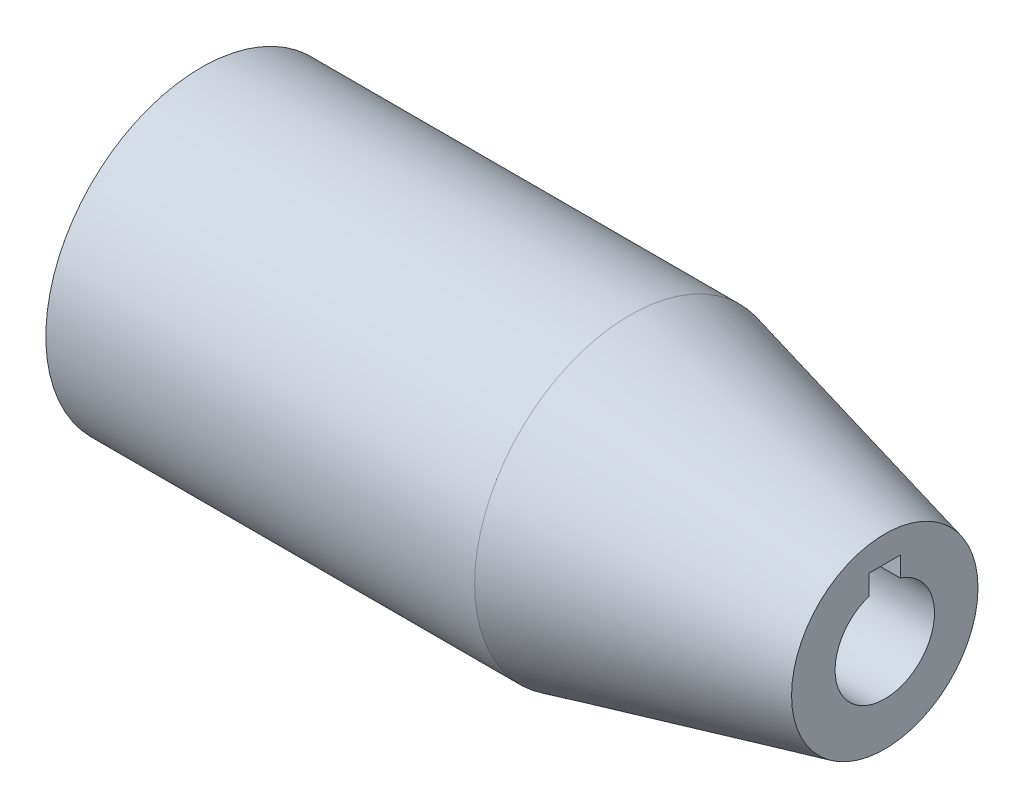
ISO-10303-21;
HEADER;
FILE_DESCRIPTION(('STEP AP214'),'2;1');
FILE_NAME('part.step','',(''),(''),'','','');
FILE_SCHEMA(('AUTOMOTIVE_DESIGN { 1 0 10303 214 1 1 1 1 }'));
ENDSEC;
DATA;
#1=APPLICATION_CONTEXT('core data for automotive mechanical design processes');
#2=APPLICATION_PROTOCOL_DEFINITION('international standard','automotive_design',2000,#1);
#3=PRODUCT_CONTEXT('',#1,'mechanical');
#4=PRODUCT('Part','Part','',(#3));
#5=PRODUCT_RELATED_PRODUCT_CATEGORY('part','',(#4));
#6=PRODUCT_DEFINITION_FORMATION('','',#4);
#7=PRODUCT_DEFINITION_CONTEXT('part definition',#1,'design');
#8=PRODUCT_DEFINITION('design','',#6,#7);
#9=PRODUCT_DEFINITION_SHAPE('','',#8);
#10=(LENGTH_UNIT() NAMED_UNIT(*) SI_UNIT(.MILLI.,.METRE.));
#11=(NAMED_UNIT(*) PLANE_ANGLE_UNIT() SI_UNIT($,.RADIAN.));
#12=(NAMED_UNIT(*) SI_UNIT($,.STERADIAN.) SOLID_ANGLE_UNIT());
#13=UNCERTAINTY_MEASURE_WITH_UNIT(LENGTH_MEASURE(1.E-05),#10,'distance_accuracy_value','');
#14=(GEOMETRIC_REPRESENTATION_CONTEXT(3) GLOBAL_UNCERTAINTY_ASSIGNED_CONTEXT((#13)) GLOBAL_UNIT_ASSIGNED_CONTEXT((#10,
#11,#12)) REPRESENTATION_CONTEXT('',''));
#15=CARTESIAN_POINT('',(0.,0.,0.));
#16=DIRECTION('',(0.,0.,1.));
#17=DIRECTION('',(1.,0.,0.));
#18=AXIS2_PLACEMENT_3D('',#15,#16,#17);
#19=CARTESIAN_POINT('',(-9.,0.,0.));
#20=DIRECTION('',(1.,0.,0.));
#21=DIRECTION('',(0.,0.,-1.));
#22=AXIS2_PLACEMENT_3D('',#19,#20,#21);
#23=CYLINDRICAL_SURFACE('',#22,25.);
#24=CARTESIAN_POINT('',(0.,0.,0.));
#25=DIRECTION('',(1.,0.,0.));
#26=DIRECTION('',(0.,0.,-1.));
#27=AXIS2_PLACEMENT_3D('',#24,#25,#26);
#28=CIRCLE('',#27,25.);
#29=CARTESIAN_POINT('',(0.,0.,-25.));
#30=VERTEX_POINT('',#29);
#31=EDGE_CURVE('E141',#30,#30,#28,.T.);
#32=ORIENTED_EDGE('',*,*,#31,.F.);
#33=EDGE_LOOP('',(#32));
#34=FACE_BOUND('',#33,.T.);
#35=CARTESIAN_POINT('',(-69.,0.,0.));
#36=DIRECTION('',(1.,0.,0.));
#37=DIRECTION('',(0.,0.,-1.));
#38=AXIS2_PLACEMENT_3D('',#35,#36,#37);
#39=CIRCLE('',#38,25.);
#40=CARTESIAN_POINT('',(-69.,0.,-25.));
#41=VERTEX_POINT('',#40);
#42=EDGE_CURVE('E121',#41,#41,#39,.T.);
#43=ORIENTED_EDGE('',*,*,#42,.T.);
#44=EDGE_LOOP('',(#43));
#45=FACE_BOUND('',#44,.T.);
#46=ADVANCED_FACE('F36',(#34,#45),#23,.T.);
#47=CARTESIAN_POINT('',(-69.,0.,0.));
#48=DIRECTION('',(1.,0.,0.));
#49=DIRECTION('',(0.,0.,-1.));
#50=AXIS2_PLACEMENT_3D('',#47,#48,#49);
#51=CYLINDRICAL_SURFACE('',#50,14.);
#52=CARTESIAN_POINT('',(-9.,0.,0.));
#53=DIRECTION('',(1.,0.,0.));
#54=DIRECTION('',(0.,0.,-1.));
#55=AXIS2_PLACEMENT_3D('',#52,#53,#54);
#56=CIRCLE('',#55,14.);
#57=CARTESIAN_POINT('',(-9.,13.4164078649987,4.));
#58=VERTEX_POINT('',#57);
#59=CARTESIAN_POINT('',(-9.,13.4164078649987,-4.));
#60=VERTEX_POINT('',#59);
#61=EDGE_CURVE('E136',#58,#60,#56,.T.);
#62=ORIENTED_EDGE('',*,*,#61,.T.);
#63=DIRECTION('',(1.,0.,0.));
#64=VECTOR('',#63,1.);
#65=CARTESIAN_POINT('',(-69.,13.4164078649987,-4.));
#66=LINE('',#65,#64);
#67=CARTESIAN_POINT('',(-69.,13.4164078649987,-4.));
#68=VERTEX_POINT('',#67);
#69=EDGE_CURVE('E124',#68,#60,#66,.T.);
#70=ORIENTED_EDGE('',*,*,#69,.F.);
#71=CARTESIAN_POINT('',(-69.,0.,0.));
#72=DIRECTION('',(1.,0.,0.));
#73=DIRECTION('',(0.,0.,-1.));
#74=AXIS2_PLACEMENT_3D('',#71,#72,#73);
#75=CIRCLE('',#74,14.);
#76=CARTESIAN_POINT('',(-69.,13.4164078649987,4.));
#77=VERTEX_POINT('',#76);
#78=EDGE_CURVE('E105',#77,#68,#75,.T.);
#79=ORIENTED_EDGE('',*,*,#78,.F.);
#80=DIRECTION('',(1.,0.,0.));
#81=VECTOR('',#80,1.);
#82=CARTESIAN_POINT('',(-69.,13.4164078649987,4.));
#83=LINE('',#82,#81);
#84=EDGE_CURVE('E115',#77,#58,#83,.T.);
#85=ORIENTED_EDGE('',*,*,#84,.T.);
#86=EDGE_LOOP('',(#62,#70,#79,#85));
#87=FACE_BOUND('',#86,.T.);
#88=ADVANCED_FACE('F123',(#87),#51,.F.);
#89=CARTESIAN_POINT('',(-69.,0.,-4.));
#90=DIRECTION('',(0.,0.,1.));
#91=DIRECTION('',(1.,0.,0.));
#92=AXIS2_PLACEMENT_3D('',#89,#90,#91);
#93=PLANE('',#92);
#94=DIRECTION('',(0.,-1.,0.));
#95=VECTOR('',#94,1.);
#96=CARTESIAN_POINT('',(-9.,0.,-4.));
#97=LINE('',#96,#95);
#98=CARTESIAN_POINT('',(-9.,17.3,-4.));
#99=VERTEX_POINT('',#98);
#100=EDGE_CURVE('E51',#99,#60,#97,.T.);
#101=ORIENTED_EDGE('',*,*,#100,.F.);
#102=DIRECTION('',(1.,0.,0.));
#103=VECTOR('',#102,1.);
#104=CARTESIAN_POINT('',(-69.,17.3,-4.));
#105=LINE('',#104,#103);
#106=CARTESIAN_POINT('',(-69.,17.3,-4.));
#107=VERTEX_POINT('',#106);
#108=EDGE_CURVE('E142',#107,#99,#105,.T.);
#109=ORIENTED_EDGE('',*,*,#108,.F.);
#110=DIRECTION('',(0.,-1.,0.));
#111=VECTOR('',#110,1.);
#112=CARTESIAN_POINT('',(-69.,0.,-4.));
#113=LINE('',#112,#111);
#114=EDGE_CURVE('E132',#107,#68,#113,.T.);
#115=ORIENTED_EDGE('',*,*,#114,.T.);
#116=ORIENTED_EDGE('',*,*,#69,.T.);
#117=EDGE_LOOP('',(#101,#109,#115,#116));
#118=FACE_BOUND('',#117,.T.);
#119=ADVANCED_FACE('F205',(#118),#93,.T.);
#120=CARTESIAN_POINT('',(-69.,17.3,0.));
#121=DIRECTION('',(0.,1.,0.));
#122=DIRECTION('',(0.,0.,1.));
#123=AXIS2_PLACEMENT_3D('',#120,#121,#122);
#124=PLANE('',#123);
#125=DIRECTION('',(0.,0.,1.));
#126=VECTOR('',#125,1.);
#127=CARTESIAN_POINT('',(-9.,17.3,0.));
#128=LINE('',#127,#126);
#129=CARTESIAN_POINT('',(-9.,17.3,4.));
#130=VERTEX_POINT('',#129);
#131=EDGE_CURVE('E56',#99,#130,#128,.T.);
#132=ORIENTED_EDGE('',*,*,#131,.T.);
#133=DIRECTION('',(1.,0.,0.));
#134=VECTOR('',#133,1.);
#135=CARTESIAN_POINT('',(-69.,17.3,4.));
#136=LINE('',#135,#134);
#137=CARTESIAN_POINT('',(-69.,17.3,4.));
#138=VERTEX_POINT('',#137);
#139=EDGE_CURVE('E120',#138,#130,#136,.T.);
#140=ORIENTED_EDGE('',*,*,#139,.F.);
#141=DIRECTION('',(0.,0.,1.));
#142=VECTOR('',#141,1.);
#143=CARTESIAN_POINT('',(-69.,17.3,0.));
#144=LINE('',#143,#142);
#145=EDGE_CURVE('E108',#107,#138,#144,.T.);
#146=ORIENTED_EDGE('',*,*,#145,.F.);
#147=ORIENTED_EDGE('',*,*,#108,.T.);
#148=EDGE_LOOP('',(#132,#140,#146,#147));
#149=FACE_BOUND('',#148,.T.);
#150=ADVANCED_FACE('F286',(#149),#124,.F.);
#151=CARTESIAN_POINT('',(-69.,0.,4.));
#152=DIRECTION('',(0.,0.,1.));
#153=DIRECTION('',(1.,0.,0.));
#154=AXIS2_PLACEMENT_3D('',#151,#152,#153);
#155=PLANE('',#154);
#156=DIRECTION('',(0.,-1.,0.));
#157=VECTOR('',#156,1.);
#158=CARTESIAN_POINT('',(-9.,0.,4.));
#159=LINE('',#158,#157);
#160=EDGE_CURVE('E117',#130,#58,#159,.T.);
#161=ORIENTED_EDGE('',*,*,#160,.T.);
#162=ORIENTED_EDGE('',*,*,#84,.F.);
#163=DIRECTION('',(0.,-1.,0.));
#164=VECTOR('',#163,1.);
#165=CARTESIAN_POINT('',(-69.,0.,4.));
#166=LINE('',#165,#164);
#167=EDGE_CURVE('E99',#138,#77,#166,.T.);
#168=ORIENTED_EDGE('',*,*,#167,.F.);
#169=ORIENTED_EDGE('',*,*,#139,.T.);
#170=EDGE_LOOP('',(#161,#162,#168,#169));
#171=FACE_BOUND('',#170,.T.);
#172=ADVANCED_FACE('F116',(#171),#155,.F.);
#173=CARTESIAN_POINT('',(-69.,0.,0.));
#174=DIRECTION('',(1.,0.,0.));
#175=DIRECTION('',(0.,0.,-1.));
#176=AXIS2_PLACEMENT_3D('',#173,#174,#175);
#177=PLANE('',#176);
#178=ORIENTED_EDGE('',*,*,#78,.T.);
#179=ORIENTED_EDGE('',*,*,#114,.F.);
#180=ORIENTED_EDGE('',*,*,#145,.T.);
#181=ORIENTED_EDGE('',*,*,#167,.T.);
#182=EDGE_LOOP('',(#178,#179,#180,#181));
#183=FACE_BOUND('',#182,.T.);
#184=ORIENTED_EDGE('',*,*,#42,.F.);
#185=EDGE_LOOP('',(#184));
#186=FACE_BOUND('',#185,.T.);
#187=ADVANCED_FACE('F101',(#183,#186),#177,.F.);
#188=CARTESIAN_POINT('',(-9.,0.,0.));
#189=DIRECTION('',(1.,0.,0.));
#190=DIRECTION('',(0.,0.,-1.));
#191=AXIS2_PLACEMENT_3D('',#188,#189,#190);
#192=PLANE('',#191);
#193=ORIENTED_EDGE('',*,*,#61,.F.);
#194=ORIENTED_EDGE('',*,*,#160,.F.);
#195=ORIENTED_EDGE('',*,*,#131,.F.);
#196=ORIENTED_EDGE('',*,*,#100,.T.);
#197=EDGE_LOOP('',(#193,#194,#195,#196));
#198=FACE_BOUND('',#197,.T.);
#199=ADVANCED_FACE('F256',(#198),#192,.F.);
#200=CARTESIAN_POINT('',(41.,0.,0.));
#201=DIRECTION('',(-1.,0.,0.));
#202=DIRECTION('',(0.,0.,1.));
#203=AXIS2_PLACEMENT_3D('',#200,#201,#202);
#204=CONICAL_SURFACE('',#203,15.,0.239231599963661);
#205=ORIENTED_EDGE('',*,*,#31,.T.);
#206=EDGE_LOOP('',(#205));
#207=FACE_BOUND('',#206,.T.);
#208=CARTESIAN_POINT('',(41.,0.,0.));
#209=DIRECTION('',(-1.,0.,0.));
#210=DIRECTION('',(0.,0.,1.));
#211=AXIS2_PLACEMENT_3D('',#208,#209,#210);
#212=CIRCLE('',#211,15.);
#213=CARTESIAN_POINT('',(41.,0.,15.));
#214=VERTEX_POINT('',#213);
#215=EDGE_CURVE('E129',#214,#214,#212,.T.);
#216=ORIENTED_EDGE('',*,*,#215,.T.);
#217=EDGE_LOOP('',(#216));
#218=FACE_BOUND('',#217,.T.);
#219=ADVANCED_FACE('F254',(#207,#218),#204,.T.);
#220=CARTESIAN_POINT('',(0.,0.,0.));
#221=DIRECTION('',(1.,0.,0.));
#222=DIRECTION('',(0.,0.,-1.));
#223=AXIS2_PLACEMENT_3D('',#220,#221,#222);
#224=PLANE('',#223);
#225=DIRECTION('',(0.,-1.,0.));
#226=VECTOR('',#225,1.);
#227=CARTESIAN_POINT('',(0.,0.,2.5));
#228=LINE('',#227,#226);
#229=CARTESIAN_POINT('',(0.,10.8,2.5));
#230=VERTEX_POINT('',#229);
#231=CARTESIAN_POINT('',(0.,7.59934207678533,2.5));
#232=VERTEX_POINT('',#231);
#233=EDGE_CURVE('E162',#230,#232,#228,.T.);
#234=ORIENTED_EDGE('',*,*,#233,.T.);
#235=CARTESIAN_POINT('',(0.,0.,0.));
#236=DIRECTION('',(1.,0.,0.));
#237=DIRECTION('',(0.,0.,-1.));
#238=AXIS2_PLACEMENT_3D('',#235,#236,#237);
#239=CIRCLE('',#238,8.);
#240=CARTESIAN_POINT('',(0.,7.59934207678533,-2.5));
#241=VERTEX_POINT('',#240);
#242=EDGE_CURVE('E147',#232,#241,#239,.T.);
#243=ORIENTED_EDGE('',*,*,#242,.T.);
#244=DIRECTION('',(0.,-1.,0.));
#245=VECTOR('',#244,1.);
#246=CARTESIAN_POINT('',(0.,0.,-2.5));
#247=LINE('',#246,#245);
#248=CARTESIAN_POINT('',(0.,10.8,-2.5));
#249=VERTEX_POINT('',#248);
#250=EDGE_CURVE('E152',#249,#241,#247,.T.);
#251=ORIENTED_EDGE('',*,*,#250,.F.);
#252=DIRECTION('',(0.,0.,1.));
#253=VECTOR('',#252,1.);
#254=CARTESIAN_POINT('',(0.,10.8,0.));
#255=LINE('',#254,#253);
#256=EDGE_CURVE('E164',#249,#230,#255,.T.);
#257=ORIENTED_EDGE('',*,*,#256,.T.);
#258=EDGE_LOOP('',(#234,#243,#251,#257));
#259=FACE_BOUND('',#258,.T.);
#260=ADVANCED_FACE('F183',(#259),#224,.T.);
#261=CARTESIAN_POINT('',(41.,0.,-2.5));
#262=DIRECTION('',(0.,0.,-1.));
#263=DIRECTION('',(-1.,0.,0.));
#264=AXIS2_PLACEMENT_3D('',#261,#262,#263);
#265=PLANE('',#264);
#266=ORIENTED_EDGE('',*,*,#250,.T.);
#267=DIRECTION('',(-1.,0.,0.));
#268=VECTOR('',#267,1.);
#269=CARTESIAN_POINT('',(41.,7.59934207678533,-2.5));
#270=LINE('',#269,#268);
#271=CARTESIAN_POINT('',(41.,7.59934207678533,-2.5));
#272=VERTEX_POINT('',#271);
#273=EDGE_CURVE('E160',#272,#241,#270,.T.);
#274=ORIENTED_EDGE('',*,*,#273,.F.);
#275=DIRECTION('',(0.,-1.,0.));
#276=VECTOR('',#275,1.);
#277=CARTESIAN_POINT('',(41.,0.,-2.5));
#278=LINE('',#277,#276);
#279=CARTESIAN_POINT('',(41.,10.8,-2.5));
#280=VERTEX_POINT('',#279);
#281=EDGE_CURVE('E158',#280,#272,#278,.T.);
#282=ORIENTED_EDGE('',*,*,#281,.F.);
#283=DIRECTION('',(-1.,0.,0.));
#284=VECTOR('',#283,1.);
#285=CARTESIAN_POINT('',(41.,10.8,-2.5));
#286=LINE('',#285,#284);
#287=EDGE_CURVE('E170',#280,#249,#286,.T.);
#288=ORIENTED_EDGE('',*,*,#287,.T.);
#289=EDGE_LOOP('',(#266,#274,#282,#288));
#290=FACE_BOUND('',#289,.T.);
#291=ADVANCED_FACE('F187',(#290),#265,.F.);
#292=CARTESIAN_POINT('',(41.,10.8,0.));
#293=DIRECTION('',(0.,-1.,0.));
#294=DIRECTION('',(0.,0.,-1.));
#295=AXIS2_PLACEMENT_3D('',#292,#293,#294);
#296=PLANE('',#295);
#297=ORIENTED_EDGE('',*,*,#256,.F.);
#298=ORIENTED_EDGE('',*,*,#287,.F.);
#299=DIRECTION('',(0.,0.,1.));
#300=VECTOR('',#299,1.);
#301=CARTESIAN_POINT('',(41.,10.8,0.));
#302=LINE('',#301,#300);
#303=CARTESIAN_POINT('',(41.,10.8,2.5));
#304=VERTEX_POINT('',#303);
#305=EDGE_CURVE('E155',#280,#304,#302,.T.);
#306=ORIENTED_EDGE('',*,*,#305,.T.);
#307=DIRECTION('',(-1.,0.,0.));
#308=VECTOR('',#307,1.);
#309=CARTESIAN_POINT('',(41.,10.8,2.5));
#310=LINE('',#309,#308);
#311=EDGE_CURVE('E44',#304,#230,#310,.T.);
#312=ORIENTED_EDGE('',*,*,#311,.T.);
#313=EDGE_LOOP('',(#297,#298,#306,#312));
#314=FACE_BOUND('',#313,.T.);
#315=ADVANCED_FACE('F176',(#314),#296,.T.);
#316=CARTESIAN_POINT('',(41.,0.,2.5));
#317=DIRECTION('',(0.,0.,-1.));
#318=DIRECTION('',(-1.,0.,0.));
#319=AXIS2_PLACEMENT_3D('',#316,#317,#318);
#320=PLANE('',#319);
#321=ORIENTED_EDGE('',*,*,#233,.F.);
#322=ORIENTED_EDGE('',*,*,#311,.F.);
#323=DIRECTION('',(0.,-1.,0.));
#324=VECTOR('',#323,1.);
#325=CARTESIAN_POINT('',(41.,0.,2.5));
#326=LINE('',#325,#324);
#327=CARTESIAN_POINT('',(41.,7.59934207678533,2.5));
#328=VERTEX_POINT('',#327);
#329=EDGE_CURVE('E151',#304,#328,#326,.T.);
#330=ORIENTED_EDGE('',*,*,#329,.T.);
#331=DIRECTION('',(-1.,0.,0.));
#332=VECTOR('',#331,1.);
#333=CARTESIAN_POINT('',(41.,7.59934207678533,2.5));
#334=LINE('',#333,#332);
#335=EDGE_CURVE('E11',#328,#232,#334,.T.);
#336=ORIENTED_EDGE('',*,*,#335,.T.);
#337=EDGE_LOOP('',(#321,#322,#330,#336));
#338=FACE_BOUND('',#337,.T.);
#339=ADVANCED_FACE('F180',(#338),#320,.T.);
#340=CARTESIAN_POINT('',(41.,0.,0.));
#341=DIRECTION('',(-1.,0.,0.));
#342=DIRECTION('',(0.,0.,1.));
#343=AXIS2_PLACEMENT_3D('',#340,#341,#342);
#344=CYLINDRICAL_SURFACE('',#343,8.);
#345=ORIENTED_EDGE('',*,*,#242,.F.);
#346=ORIENTED_EDGE('',*,*,#335,.F.);
#347=CARTESIAN_POINT('',(41.,0.,0.));
#348=DIRECTION('',(1.,0.,0.));
#349=DIRECTION('',(0.,0.,-1.));
#350=AXIS2_PLACEMENT_3D('',#347,#348,#349);
#351=CIRCLE('',#350,8.);
#352=EDGE_CURVE('E148',#328,#272,#351,.T.);
#353=ORIENTED_EDGE('',*,*,#352,.T.);
#354=ORIENTED_EDGE('',*,*,#273,.T.);
#355=EDGE_LOOP('',(#345,#346,#353,#354));
#356=FACE_BOUND('',#355,.T.);
#357=ADVANCED_FACE('F38',(#356),#344,.F.);
#358=CARTESIAN_POINT('',(41.,0.,0.));
#359=DIRECTION('',(1.,0.,0.));
#360=DIRECTION('',(0.,0.,-1.));
#361=AXIS2_PLACEMENT_3D('',#358,#359,#360);
#362=PLANE('',#361);
#363=ORIENTED_EDGE('',*,*,#352,.F.);
#364=ORIENTED_EDGE('',*,*,#329,.F.);
#365=ORIENTED_EDGE('',*,*,#305,.F.);
#366=ORIENTED_EDGE('',*,*,#281,.T.);
#367=EDGE_LOOP('',(#363,#364,#365,#366));
#368=FACE_BOUND('',#367,.T.);
#369=ORIENTED_EDGE('',*,*,#215,.F.);
#370=EDGE_LOOP('',(#369));
#371=FACE_BOUND('',#370,.T.);
#372=ADVANCED_FACE('F190',(#368,#371),#362,.T.);
#373=CLOSED_SHELL('',(#46,#88,#119,#150,#172,#187,#199,#219,#260,#291,#315,#339,#357,#372));
#374=MANIFOLD_SOLID_BREP('B2',#373);
#375=ADVANCED_BREP_SHAPE_REPRESENTATION('',(#18,#374),#14);
#376=SHAPE_DEFINITION_REPRESENTATION(#9,#375);
ENDSEC;
END-ISO-10303-21;
